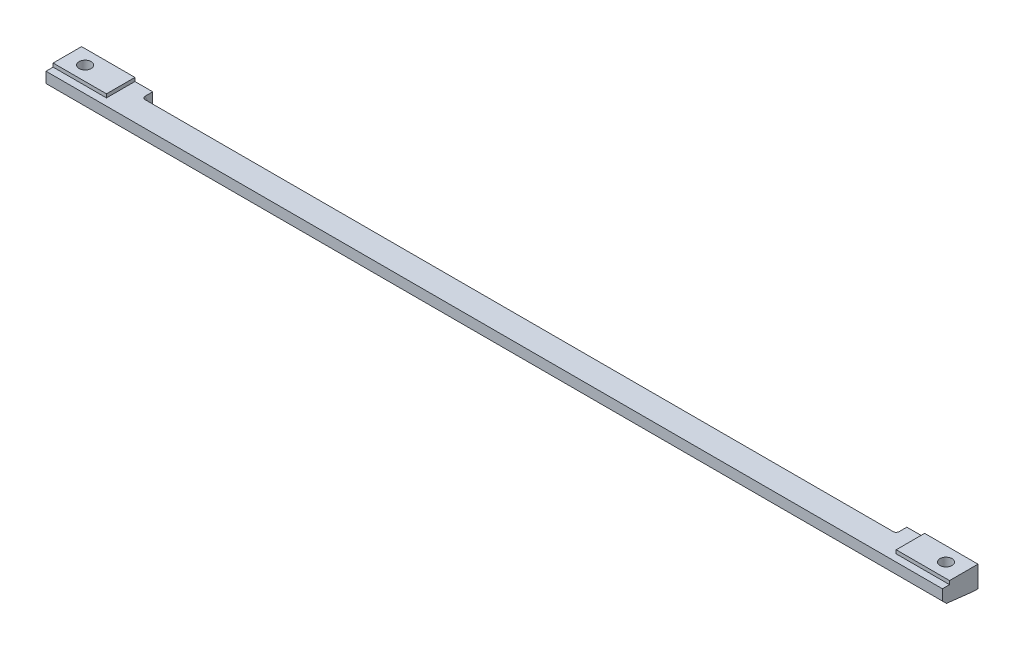
ISO-10303-21;
HEADER;
FILE_DESCRIPTION(('STEP AP214'),'2;1');
FILE_NAME('part.step','',(''),(''),'','','');
FILE_SCHEMA(('AUTOMOTIVE_DESIGN { 1 0 10303 214 1 1 1 1 }'));
ENDSEC;
DATA;
#1=APPLICATION_CONTEXT('core data for automotive mechanical design processes');
#2=APPLICATION_PROTOCOL_DEFINITION('international standard','automotive_design',2000,#1);
#3=PRODUCT_CONTEXT('',#1,'mechanical');
#4=PRODUCT('Part','Part','',(#3));
#5=PRODUCT_RELATED_PRODUCT_CATEGORY('part','',(#4));
#6=PRODUCT_DEFINITION_FORMATION('','',#4);
#7=PRODUCT_DEFINITION_CONTEXT('part definition',#1,'design');
#8=PRODUCT_DEFINITION('design','',#6,#7);
#9=PRODUCT_DEFINITION_SHAPE('','',#8);
#10=(LENGTH_UNIT() NAMED_UNIT(*) SI_UNIT(.MILLI.,.METRE.));
#11=(NAMED_UNIT(*) PLANE_ANGLE_UNIT() SI_UNIT($,.RADIAN.));
#12=(NAMED_UNIT(*) SI_UNIT($,.STERADIAN.) SOLID_ANGLE_UNIT());
#13=UNCERTAINTY_MEASURE_WITH_UNIT(LENGTH_MEASURE(1.E-05),#10,'distance_accuracy_value','');
#14=(GEOMETRIC_REPRESENTATION_CONTEXT(3) GLOBAL_UNCERTAINTY_ASSIGNED_CONTEXT((#13)) GLOBAL_UNIT_ASSIGNED_CONTEXT((#10,
#11,#12)) REPRESENTATION_CONTEXT('',''));
#15=CARTESIAN_POINT('',(0.,0.,0.));
#16=DIRECTION('',(0.,0.,1.));
#17=DIRECTION('',(1.,0.,0.));
#18=AXIS2_PLACEMENT_3D('',#15,#16,#17);
#19=CARTESIAN_POINT('',(-126.,0.,10.));
#20=DIRECTION('',(0.,1.,0.));
#21=DIRECTION('',(-1.,0.,0.));
#22=AXIS2_PLACEMENT_3D('',#19,#20,#21);
#23=PLANE('',#22);
#24=DIRECTION('',(-1.,0.,0.));
#25=VECTOR('',#24,1.);
#26=CARTESIAN_POINT('',(126.,0.,1.3));
#27=LINE('',#26,#25);
#28=CARTESIAN_POINT('',(126.,0.,1.3));
#29=VERTEX_POINT('',#28);
#30=CARTESIAN_POINT('',(122.809005251513,0.,1.3));
#31=VERTEX_POINT('',#30);
#32=EDGE_CURVE('E187',#29,#31,#27,.T.);
#33=ORIENTED_EDGE('',*,*,#32,.T.);
#34=CARTESIAN_POINT('',(121.,0.,4.));
#35=DIRECTION('',(0.,-1.,0.));
#36=DIRECTION('',(0.,0.,-1.));
#37=AXIS2_PLACEMENT_3D('',#34,#35,#36);
#38=CIRCLE('',#37,3.25);
#39=CARTESIAN_POINT('',(119.190994748487,0.,1.30000000000019));
#40=VERTEX_POINT('',#39);
#41=EDGE_CURVE('E54',#40,#31,#38,.T.);
#42=ORIENTED_EDGE('',*,*,#41,.F.);
#43=CARTESIAN_POINT('',(-119.190994748487,0.,1.3));
#44=VERTEX_POINT('',#43);
#45=EDGE_CURVE('E185',#40,#44,#27,.T.);
#46=ORIENTED_EDGE('',*,*,#45,.T.);
#47=CARTESIAN_POINT('',(-121.,0.,4.));
#48=DIRECTION('',(0.,-1.,0.));
#49=DIRECTION('',(0.,0.,-1.));
#50=AXIS2_PLACEMENT_3D('',#47,#48,#49);
#51=CIRCLE('',#50,3.25);
#52=CARTESIAN_POINT('',(-122.809005251513,0.,1.3));
#53=VERTEX_POINT('',#52);
#54=EDGE_CURVE('E296',#53,#44,#51,.T.);
#55=ORIENTED_EDGE('',*,*,#54,.F.);
#56=CARTESIAN_POINT('',(-126.,0.,1.3));
#57=VERTEX_POINT('',#56);
#58=EDGE_CURVE('E192',#53,#57,#27,.T.);
#59=ORIENTED_EDGE('',*,*,#58,.T.);
#60=DIRECTION('',(0.,0.,-1.));
#61=VECTOR('',#60,1.);
#62=CARTESIAN_POINT('',(-126.,0.,10.));
#63=LINE('',#62,#61);
#64=CARTESIAN_POINT('',(-126.,0.,0.));
#65=VERTEX_POINT('',#64);
#66=EDGE_CURVE('E249',#57,#65,#63,.T.);
#67=ORIENTED_EDGE('',*,*,#66,.T.);
#68=DIRECTION('',(1.,0.,0.));
#69=VECTOR('',#68,1.);
#70=CARTESIAN_POINT('',(-126.,0.,0.));
#71=LINE('',#70,#69);
#72=CARTESIAN_POINT('',(-105.997126220878,0.,0.));
#73=VERTEX_POINT('',#72);
#74=EDGE_CURVE('E220',#65,#73,#71,.T.);
#75=ORIENTED_EDGE('',*,*,#74,.T.);
#76=CARTESIAN_POINT('',(-105.2,0.,-0.0740160181598715));
#77=DIRECTION('',(0.,1.,0.));
#78=DIRECTION('',(0.,0.,1.));
#79=AXIS2_PLACEMENT_3D('',#76,#77,#78);
#80=ELLIPSE('',#79,0.874016018159853,0.8);
#81=CARTESIAN_POINT('',(-105.2,0.,0.8));
#82=VERTEX_POINT('',#81);
#83=EDGE_CURVE('E276',#73,#82,#80,.T.);
#84=ORIENTED_EDGE('',*,*,#83,.T.);
#85=DIRECTION('',(1.,0.,0.));
#86=VECTOR('',#85,1.);
#87=CARTESIAN_POINT('',(-106.,0.,0.8));
#88=LINE('',#87,#86);
#89=CARTESIAN_POINT('',(105.2,0.,0.8));
#90=VERTEX_POINT('',#89);
#91=EDGE_CURVE('E210',#82,#90,#88,.T.);
#92=ORIENTED_EDGE('',*,*,#91,.T.);
#93=CARTESIAN_POINT('',(105.2,0.,-0.0740160181598545));
#94=DIRECTION('',(0.,1.,0.));
#95=DIRECTION('',(0.,0.,-1.));
#96=AXIS2_PLACEMENT_3D('',#93,#94,#95);
#97=ELLIPSE('',#96,0.874016018159853,0.8);
#98=CARTESIAN_POINT('',(105.997126220878,0.,0.));
#99=VERTEX_POINT('',#98);
#100=EDGE_CURVE('E280',#90,#99,#97,.T.);
#101=ORIENTED_EDGE('',*,*,#100,.T.);
#102=CARTESIAN_POINT('',(126.,0.,0.));
#103=VERTEX_POINT('',#102);
#104=EDGE_CURVE('E246',#99,#103,#71,.T.);
#105=ORIENTED_EDGE('',*,*,#104,.T.);
#106=DIRECTION('',(0.,0.,-1.));
#107=VECTOR('',#106,1.);
#108=CARTESIAN_POINT('',(126.,0.,10.));
#109=LINE('',#108,#107);
#110=EDGE_CURVE('E224',#29,#103,#109,.T.);
#111=ORIENTED_EDGE('',*,*,#110,.F.);
#112=EDGE_LOOP('',(#33,#42,#46,#55,#59,#67,#75,#84,#92,#101,#105,#111));
#113=FACE_BOUND('',#112,.T.);
#114=ADVANCED_FACE('F40',(#113),#23,.F.);
#115=CARTESIAN_POINT('',(126.,6.00000000000005,0.));
#116=DIRECTION('',(0.,0.,1.));
#117=DIRECTION('',(1.,0.,0.));
#118=AXIS2_PLACEMENT_3D('',#115,#116,#117);
#119=PLANE('',#118);
#120=CARTESIAN_POINT('',(116.,3.50000000000005,0.));
#121=DIRECTION('',(0.,0.,-1.));
#122=DIRECTION('',(-1.,0.,0.));
#123=AXIS2_PLACEMENT_3D('',#120,#121,#122);
#124=CIRCLE('',#123,1.025);
#125=CARTESIAN_POINT('',(114.975,3.50000000000005,0.));
#126=VERTEX_POINT('',#125);
#127=EDGE_CURVE('E311',#126,#126,#124,.T.);
#128=ORIENTED_EDGE('',*,*,#127,.F.);
#129=EDGE_LOOP('',(#128));
#130=FACE_BOUND('',#129,.T.);
#131=ORIENTED_EDGE('',*,*,#104,.F.);
#132=CARTESIAN_POINT('',(105.2,0.168218223090618,0.));
#133=DIRECTION('',(0.,0.,1.));
#134=DIRECTION('',(0.,-1.,0.));
#135=AXIS2_PLACEMENT_3D('',#132,#133,#134);
#136=ELLIPSE('',#135,1.98640004127236,0.8);
#137=CARTESIAN_POINT('',(106.,0.168218223090618,0.));
#138=VERTEX_POINT('',#137);
#139=EDGE_CURVE('E283',#99,#138,#136,.T.);
#140=ORIENTED_EDGE('',*,*,#139,.T.);
#141=DIRECTION('',(0.,1.,0.));
#142=VECTOR('',#141,1.);
#143=CARTESIAN_POINT('',(106.,4.99999999999996,0.));
#144=LINE('',#143,#142);
#145=CARTESIAN_POINT('',(106.,4.99999999999996,0.));
#146=VERTEX_POINT('',#145);
#147=EDGE_CURVE('E194',#138,#146,#144,.T.);
#148=ORIENTED_EDGE('',*,*,#147,.T.);
#149=DIRECTION('',(-1.,0.,0.));
#150=VECTOR('',#149,1.);
#151=CARTESIAN_POINT('',(111.,4.99999999999996,0.));
#152=LINE('',#151,#150);
#153=CARTESIAN_POINT('',(111.,4.99999999999996,0.));
#154=VERTEX_POINT('',#153);
#155=EDGE_CURVE('E234',#154,#146,#152,.T.);
#156=ORIENTED_EDGE('',*,*,#155,.F.);
#157=DIRECTION('',(0.,-1.,0.));
#158=VECTOR('',#157,1.);
#159=CARTESIAN_POINT('',(111.,6.00000000000004,0.));
#160=LINE('',#159,#158);
#161=CARTESIAN_POINT('',(111.,6.00000000000004,0.));
#162=VERTEX_POINT('',#161);
#163=EDGE_CURVE('E230',#162,#154,#160,.T.);
#164=ORIENTED_EDGE('',*,*,#163,.F.);
#165=DIRECTION('',(-1.,0.,0.));
#166=VECTOR('',#165,1.);
#167=CARTESIAN_POINT('',(126.,6.00000000000005,0.));
#168=LINE('',#167,#166);
#169=CARTESIAN_POINT('',(126.,6.00000000000005,0.));
#170=VERTEX_POINT('',#169);
#171=EDGE_CURVE('E227',#170,#162,#168,.T.);
#172=ORIENTED_EDGE('',*,*,#171,.F.);
#173=DIRECTION('',(0.,1.,0.));
#174=VECTOR('',#173,1.);
#175=CARTESIAN_POINT('',(126.,0.,0.));
#176=LINE('',#175,#174);
#177=EDGE_CURVE('E213',#103,#170,#176,.T.);
#178=ORIENTED_EDGE('',*,*,#177,.F.);
#179=EDGE_LOOP('',(#131,#140,#148,#156,#164,#172,#178));
#180=FACE_BOUND('',#179,.T.);
#181=ADVANCED_FACE('F392',(#130,#180),#119,.F.);
#182=CARTESIAN_POINT('',(126.,0.,10.));
#183=DIRECTION('',(-1.,0.,0.));
#184=DIRECTION('',(0.,0.,1.));
#185=AXIS2_PLACEMENT_3D('',#182,#183,#184);
#186=PLANE('',#185);
#187=DIRECTION('',(0.,0.,-1.));
#188=VECTOR('',#187,1.);
#189=CARTESIAN_POINT('',(126.,6.00000000000005,10.));
#190=LINE('',#189,#188);
#191=CARTESIAN_POINT('',(126.,6.00000000000002,8.));
#192=VERTEX_POINT('',#191);
#193=EDGE_CURVE('E261',#192,#170,#190,.T.);
#194=ORIENTED_EDGE('',*,*,#193,.F.);
#195=DIRECTION('',(0.,1.,0.));
#196=VECTOR('',#195,1.);
#197=CARTESIAN_POINT('',(126.,5.00000000000002,8.));
#198=LINE('',#197,#196);
#199=CARTESIAN_POINT('',(126.,5.00000000000002,8.));
#200=VERTEX_POINT('',#199);
#201=EDGE_CURVE('E335',#200,#192,#198,.T.);
#202=ORIENTED_EDGE('',*,*,#201,.F.);
#203=DIRECTION('',(0.,0.,-1.));
#204=VECTOR('',#203,1.);
#205=CARTESIAN_POINT('',(126.,5.00000000000002,10.));
#206=LINE('',#205,#204);
#207=CARTESIAN_POINT('',(126.,5.00000000000002,10.));
#208=VERTEX_POINT('',#207);
#209=EDGE_CURVE('E330',#208,#200,#206,.T.);
#210=ORIENTED_EDGE('',*,*,#209,.F.);
#211=DIRECTION('',(0.,1.,0.));
#212=VECTOR('',#211,1.);
#213=CARTESIAN_POINT('',(126.,0.,10.));
#214=LINE('',#213,#212);
#215=CARTESIAN_POINT('',(126.,2.00000000000002,10.));
#216=VERTEX_POINT('',#215);
#217=EDGE_CURVE('E216',#216,#208,#214,.T.);
#218=ORIENTED_EDGE('',*,*,#217,.F.);
#219=DIRECTION('',(0.,-0.707106781186556,-0.707106781186539));
#220=VECTOR('',#219,1.);
#221=CARTESIAN_POINT('',(126.,0.870129870129871,8.87012987012988));
#222=LINE('',#221,#220);
#223=CARTESIAN_POINT('',(126.,0.870129870129871,8.87012987012988));
#224=VERTEX_POINT('',#223);
#225=EDGE_CURVE('E295',#216,#224,#222,.T.);
#226=ORIENTED_EDGE('',*,*,#225,.T.);
#227=DIRECTION('',(0.,-0.114190672624496,-0.993458851833112));
#228=VECTOR('',#227,1.);
#229=CARTESIAN_POINT('',(126.,0.,1.3));
#230=LINE('',#229,#228);
#231=EDGE_CURVE('E195',#224,#29,#230,.T.);
#232=ORIENTED_EDGE('',*,*,#231,.T.);
#233=ORIENTED_EDGE('',*,*,#110,.T.);
#234=ORIENTED_EDGE('',*,*,#177,.T.);
#235=EDGE_LOOP('',(#194,#202,#210,#218,#226,#232,#233,#234));
#236=FACE_BOUND('',#235,.T.);
#237=ADVANCED_FACE('F407',(#236),#186,.F.);
#238=CARTESIAN_POINT('',(126.,6.00000000000005,10.));
#239=DIRECTION('',(0.,-1.,0.));
#240=DIRECTION('',(1.,0.,0.));
#241=AXIS2_PLACEMENT_3D('',#238,#239,#240);
#242=PLANE('',#241);
#243=CARTESIAN_POINT('',(121.,6.00000000000009,4.));
#244=DIRECTION('',(0.,-1.,0.));
#245=DIRECTION('',(0.,0.,-1.));
#246=AXIS2_PLACEMENT_3D('',#243,#244,#245);
#247=CIRCLE('',#246,1.69999999999999);
#248=CARTESIAN_POINT('',(121.,6.00000000000009,2.30000000000001));
#249=VERTEX_POINT('',#248);
#250=EDGE_CURVE('E300',#249,#249,#247,.T.);
#251=ORIENTED_EDGE('',*,*,#250,.T.);
#252=EDGE_LOOP('',(#251));
#253=FACE_BOUND('',#252,.T.);
#254=DIRECTION('',(0.,0.,-1.));
#255=VECTOR('',#254,1.);
#256=CARTESIAN_POINT('',(111.,6.00000000000004,10.));
#257=LINE('',#256,#255);
#258=CARTESIAN_POINT('',(111.,6.00000000000002,8.));
#259=VERTEX_POINT('',#258);
#260=EDGE_CURVE('E259',#259,#162,#257,.T.);
#261=ORIENTED_EDGE('',*,*,#260,.F.);
#262=DIRECTION('',(-1.,0.,0.));
#263=VECTOR('',#262,1.);
#264=CARTESIAN_POINT('',(111.,6.00000000000002,8.));
#265=LINE('',#264,#263);
#266=EDGE_CURVE('E329',#192,#259,#265,.T.);
#267=ORIENTED_EDGE('',*,*,#266,.F.);
#268=ORIENTED_EDGE('',*,*,#193,.T.);
#269=ORIENTED_EDGE('',*,*,#171,.T.);
#270=EDGE_LOOP('',(#261,#267,#268,#269));
#271=FACE_BOUND('',#270,.T.);
#272=ADVANCED_FACE('F404',(#253,#271),#242,.F.);
#273=CARTESIAN_POINT('',(111.,6.00000000000004,10.));
#274=DIRECTION('',(1.,0.,0.));
#275=DIRECTION('',(0.,0.,-1.));
#276=AXIS2_PLACEMENT_3D('',#273,#274,#275);
#277=PLANE('',#276);
#278=DIRECTION('',(0.,0.,-1.));
#279=VECTOR('',#278,1.);
#280=CARTESIAN_POINT('',(111.,4.99999999999996,10.));
#281=LINE('',#280,#279);
#282=CARTESIAN_POINT('',(111.,5.00000000000002,8.));
#283=VERTEX_POINT('',#282);
#284=EDGE_CURVE('E257',#283,#154,#281,.T.);
#285=ORIENTED_EDGE('',*,*,#284,.F.);
#286=DIRECTION('',(0.,1.,0.));
#287=VECTOR('',#286,1.);
#288=CARTESIAN_POINT('',(111.,5.00000000000002,8.));
#289=LINE('',#288,#287);
#290=EDGE_CURVE('E337',#283,#259,#289,.T.);
#291=ORIENTED_EDGE('',*,*,#290,.T.);
#292=ORIENTED_EDGE('',*,*,#260,.T.);
#293=ORIENTED_EDGE('',*,*,#163,.T.);
#294=EDGE_LOOP('',(#285,#291,#292,#293));
#295=FACE_BOUND('',#294,.T.);
#296=ADVANCED_FACE('F400',(#295),#277,.F.);
#297=CARTESIAN_POINT('',(111.,4.99999999999996,10.));
#298=DIRECTION('',(0.,-1.,0.));
#299=DIRECTION('',(0.,0.,-1.));
#300=AXIS2_PLACEMENT_3D('',#297,#298,#299);
#301=PLANE('',#300);
#302=DIRECTION('',(1.,0.,0.));
#303=VECTOR('',#302,1.);
#304=CARTESIAN_POINT('',(-106.,4.99999999999996,3.));
#305=LINE('',#304,#303);
#306=CARTESIAN_POINT('',(-105.2,4.99999999999996,3.));
#307=VERTEX_POINT('',#306);
#308=CARTESIAN_POINT('',(105.2,4.99999999999996,3.));
#309=VERTEX_POINT('',#308);
#310=EDGE_CURVE('E206',#307,#309,#305,.T.);
#311=ORIENTED_EDGE('',*,*,#310,.F.);
#312=CARTESIAN_POINT('',(-105.2,4.99999999999996,2.12598398184015));
#313=DIRECTION('',(0.,-1.,0.));
#314=DIRECTION('',(0.,0.,1.));
#315=AXIS2_PLACEMENT_3D('',#312,#313,#314);
#316=ELLIPSE('',#315,0.874016018159853,0.8);
#317=CARTESIAN_POINT('',(-106.,4.99999999999996,2.12598398184015));
#318=VERTEX_POINT('',#317);
#319=EDGE_CURVE('E278',#307,#318,#316,.T.);
#320=ORIENTED_EDGE('',*,*,#319,.T.);
#321=DIRECTION('',(0.,0.,1.));
#322=VECTOR('',#321,1.);
#323=CARTESIAN_POINT('',(-106.,4.99999999999996,3.));
#324=LINE('',#323,#322);
#325=CARTESIAN_POINT('',(-106.,4.99999999999996,0.));
#326=VERTEX_POINT('',#325);
#327=EDGE_CURVE('E202',#326,#318,#324,.T.);
#328=ORIENTED_EDGE('',*,*,#327,.F.);
#329=CARTESIAN_POINT('',(-111.,4.99999999999996,0.));
#330=VERTEX_POINT('',#329);
#331=EDGE_CURVE('E233',#326,#330,#152,.T.);
#332=ORIENTED_EDGE('',*,*,#331,.T.);
#333=DIRECTION('',(0.,0.,-1.));
#334=VECTOR('',#333,1.);
#335=CARTESIAN_POINT('',(-111.,4.99999999999996,10.));
#336=LINE('',#335,#334);
#337=CARTESIAN_POINT('',(-111.,5.00000000000004,8.));
#338=VERTEX_POINT('',#337);
#339=EDGE_CURVE('E255',#338,#330,#336,.T.);
#340=ORIENTED_EDGE('',*,*,#339,.F.);
#341=DIRECTION('',(-1.,0.,0.));
#342=VECTOR('',#341,1.);
#343=CARTESIAN_POINT('',(-126.,5.00000000000005,8.));
#344=LINE('',#343,#342);
#345=CARTESIAN_POINT('',(-126.,5.00000000000005,8.));
#346=VERTEX_POINT('',#345);
#347=EDGE_CURVE('E345',#338,#346,#344,.T.);
#348=ORIENTED_EDGE('',*,*,#347,.T.);
#349=DIRECTION('',(0.,0.,1.));
#350=VECTOR('',#349,1.);
#351=CARTESIAN_POINT('',(-126.,5.00000000000005,10.));
#352=LINE('',#351,#350);
#353=CARTESIAN_POINT('',(-126.,5.00000000000005,10.));
#354=VERTEX_POINT('',#353);
#355=EDGE_CURVE('E342',#346,#354,#352,.T.);
#356=ORIENTED_EDGE('',*,*,#355,.T.);
#357=DIRECTION('',(-1.,0.,0.));
#358=VECTOR('',#357,1.);
#359=CARTESIAN_POINT('',(111.,4.99999999999996,10.));
#360=LINE('',#359,#358);
#361=EDGE_CURVE('E219',#208,#354,#360,.T.);
#362=ORIENTED_EDGE('',*,*,#361,.F.);
#363=ORIENTED_EDGE('',*,*,#209,.T.);
#364=DIRECTION('',(-1.,0.,0.));
#365=VECTOR('',#364,1.);
#366=CARTESIAN_POINT('',(111.,5.00000000000002,8.));
#367=LINE('',#366,#365);
#368=EDGE_CURVE('E332',#200,#283,#367,.T.);
#369=ORIENTED_EDGE('',*,*,#368,.T.);
#370=ORIENTED_EDGE('',*,*,#284,.T.);
#371=ORIENTED_EDGE('',*,*,#155,.T.);
#372=DIRECTION('',(0.,0.,1.));
#373=VECTOR('',#372,1.);
#374=CARTESIAN_POINT('',(106.,4.99999999999996,3.));
#375=LINE('',#374,#373);
#376=CARTESIAN_POINT('',(106.,4.99999999999996,2.12598398184015));
#377=VERTEX_POINT('',#376);
#378=EDGE_CURVE('E203',#146,#377,#375,.T.);
#379=ORIENTED_EDGE('',*,*,#378,.T.);
#380=CARTESIAN_POINT('',(105.2,4.99999999999996,2.12598398184015));
#381=DIRECTION('',(0.,-1.,0.));
#382=DIRECTION('',(0.,0.,-1.));
#383=AXIS2_PLACEMENT_3D('',#380,#381,#382);
#384=ELLIPSE('',#383,0.874016018159853,0.8);
#385=EDGE_CURVE('E285',#377,#309,#384,.T.);
#386=ORIENTED_EDGE('',*,*,#385,.T.);
#387=EDGE_LOOP('',(#311,#320,#328,#332,#340,#348,#356,#362,#363,#369,#370,#371,#379,#386));
#388=FACE_BOUND('',#387,.T.);
#389=ADVANCED_FACE('F380',(#388),#301,.F.);
#390=CARTESIAN_POINT('',(-111.,6.00000000000004,10.));
#391=DIRECTION('',(-1.,0.,0.));
#392=DIRECTION('',(0.,0.,1.));
#393=AXIS2_PLACEMENT_3D('',#390,#391,#392);
#394=PLANE('',#393);
#395=DIRECTION('',(0.,0.,-1.));
#396=VECTOR('',#395,1.);
#397=CARTESIAN_POINT('',(-111.,6.00000000000004,10.));
#398=LINE('',#397,#396);
#399=CARTESIAN_POINT('',(-111.,6.00000000000004,8.));
#400=VERTEX_POINT('',#399);
#401=CARTESIAN_POINT('',(-111.,6.00000000000004,0.));
#402=VERTEX_POINT('',#401);
#403=EDGE_CURVE('E253',#400,#402,#398,.T.);
#404=ORIENTED_EDGE('',*,*,#403,.F.);
#405=DIRECTION('',(0.,1.,0.));
#406=VECTOR('',#405,1.);
#407=CARTESIAN_POINT('',(-111.,5.00000000000004,8.));
#408=LINE('',#407,#406);
#409=EDGE_CURVE('E348',#338,#400,#408,.T.);
#410=ORIENTED_EDGE('',*,*,#409,.F.);
#411=ORIENTED_EDGE('',*,*,#339,.T.);
#412=DIRECTION('',(0.,1.,0.));
#413=VECTOR('',#412,1.);
#414=CARTESIAN_POINT('',(-111.,6.00000000000004,0.));
#415=LINE('',#414,#413);
#416=EDGE_CURVE('E237',#330,#402,#415,.T.);
#417=ORIENTED_EDGE('',*,*,#416,.T.);
#418=EDGE_LOOP('',(#404,#410,#411,#417));
#419=FACE_BOUND('',#418,.T.);
#420=ADVANCED_FACE('F429',(#419),#394,.F.);
#421=CARTESIAN_POINT('',(-126.,6.00000000000005,10.));
#422=DIRECTION('',(0.,-1.,0.));
#423=DIRECTION('',(1.,0.,0.));
#424=AXIS2_PLACEMENT_3D('',#421,#422,#423);
#425=PLANE('',#424);
#426=CARTESIAN_POINT('',(-121.,6.00000000000005,4.));
#427=DIRECTION('',(0.,-1.,0.));
#428=DIRECTION('',(0.,0.,-1.));
#429=AXIS2_PLACEMENT_3D('',#426,#427,#428);
#430=CIRCLE('',#429,1.69999999999999);
#431=CARTESIAN_POINT('',(-121.,6.00000000000005,2.30000000000001));
#432=VERTEX_POINT('',#431);
#433=EDGE_CURVE('E308',#432,#432,#430,.T.);
#434=ORIENTED_EDGE('',*,*,#433,.T.);
#435=EDGE_LOOP('',(#434));
#436=FACE_BOUND('',#435,.T.);
#437=DIRECTION('',(0.,0.,-1.));
#438=VECTOR('',#437,1.);
#439=CARTESIAN_POINT('',(-126.,6.00000000000005,10.));
#440=LINE('',#439,#438);
#441=CARTESIAN_POINT('',(-126.,6.00000000000005,8.));
#442=VERTEX_POINT('',#441);
#443=CARTESIAN_POINT('',(-126.,6.00000000000005,0.));
#444=VERTEX_POINT('',#443);
#445=EDGE_CURVE('E251',#442,#444,#440,.T.);
#446=ORIENTED_EDGE('',*,*,#445,.F.);
#447=DIRECTION('',(-1.,0.,0.));
#448=VECTOR('',#447,1.);
#449=CARTESIAN_POINT('',(-126.,6.00000000000005,8.));
#450=LINE('',#449,#448);
#451=EDGE_CURVE('E340',#400,#442,#450,.T.);
#452=ORIENTED_EDGE('',*,*,#451,.F.);
#453=ORIENTED_EDGE('',*,*,#403,.T.);
#454=DIRECTION('',(-1.,0.,0.));
#455=VECTOR('',#454,1.);
#456=CARTESIAN_POINT('',(-126.,6.00000000000005,0.));
#457=LINE('',#456,#455);
#458=EDGE_CURVE('E240',#402,#444,#457,.T.);
#459=ORIENTED_EDGE('',*,*,#458,.T.);
#460=EDGE_LOOP('',(#446,#452,#453,#459));
#461=FACE_BOUND('',#460,.T.);
#462=ADVANCED_FACE('F423',(#436,#461),#425,.F.);
#463=CARTESIAN_POINT('',(-126.,0.,10.));
#464=DIRECTION('',(1.,0.,0.));
#465=DIRECTION('',(0.,0.,-1.));
#466=AXIS2_PLACEMENT_3D('',#463,#464,#465);
#467=PLANE('',#466);
#468=ORIENTED_EDGE('',*,*,#355,.F.);
#469=DIRECTION('',(0.,1.,0.));
#470=VECTOR('',#469,1.);
#471=CARTESIAN_POINT('',(-126.,5.00000000000005,8.));
#472=LINE('',#471,#470);
#473=EDGE_CURVE('E350',#346,#442,#472,.T.);
#474=ORIENTED_EDGE('',*,*,#473,.T.);
#475=ORIENTED_EDGE('',*,*,#445,.T.);
#476=DIRECTION('',(0.,-1.,0.));
#477=VECTOR('',#476,1.);
#478=CARTESIAN_POINT('',(-126.,0.,0.));
#479=LINE('',#478,#477);
#480=EDGE_CURVE('E243',#444,#65,#479,.T.);
#481=ORIENTED_EDGE('',*,*,#480,.T.);
#482=ORIENTED_EDGE('',*,*,#66,.F.);
#483=DIRECTION('',(0.,-0.114190672624496,-0.993458851833112));
#484=VECTOR('',#483,1.);
#485=CARTESIAN_POINT('',(-126.,0.,1.3));
#486=LINE('',#485,#484);
#487=CARTESIAN_POINT('',(-126.,0.870129870129871,8.87012987012988));
#488=VERTEX_POINT('',#487);
#489=EDGE_CURVE('E198',#488,#57,#486,.T.);
#490=ORIENTED_EDGE('',*,*,#489,.F.);
#491=DIRECTION('',(0.,0.707106781186556,0.707106781186539));
#492=VECTOR('',#491,1.);
#493=CARTESIAN_POINT('',(-126.,0.870129870129871,8.87012987012988));
#494=LINE('',#493,#492);
#495=CARTESIAN_POINT('',(-126.,2.00000000000002,10.));
#496=VERTEX_POINT('',#495);
#497=EDGE_CURVE('E290',#488,#496,#494,.T.);
#498=ORIENTED_EDGE('',*,*,#497,.T.);
#499=DIRECTION('',(0.,-1.,0.));
#500=VECTOR('',#499,1.);
#501=CARTESIAN_POINT('',(-126.,0.,10.));
#502=LINE('',#501,#500);
#503=EDGE_CURVE('E222',#354,#496,#502,.T.);
#504=ORIENTED_EDGE('',*,*,#503,.F.);
#505=EDGE_LOOP('',(#468,#474,#475,#481,#482,#490,#498,#504));
#506=FACE_BOUND('',#505,.T.);
#507=ADVANCED_FACE('F361',(#506),#467,.F.);
#508=CARTESIAN_POINT('',(126.,6.00000000000005,10.));
#509=DIRECTION('',(0.,0.,1.));
#510=DIRECTION('',(1.,0.,0.));
#511=AXIS2_PLACEMENT_3D('',#508,#509,#510);
#512=PLANE('',#511);
#513=ORIENTED_EDGE('',*,*,#217,.T.);
#514=ORIENTED_EDGE('',*,*,#361,.T.);
#515=ORIENTED_EDGE('',*,*,#503,.T.);
#516=DIRECTION('',(1.,0.,0.));
#517=VECTOR('',#516,1.);
#518=CARTESIAN_POINT('',(126.,2.00000000000002,10.));
#519=LINE('',#518,#517);
#520=EDGE_CURVE('E293',#496,#216,#519,.T.);
#521=ORIENTED_EDGE('',*,*,#520,.T.);
#522=EDGE_LOOP('',(#513,#514,#515,#521));
#523=FACE_BOUND('',#522,.T.);
#524=ADVANCED_FACE('F415',(#523),#512,.T.);
#525=CARTESIAN_POINT('',(-116.,3.50000000000004,0.));
#526=DIRECTION('',(0.,0.,-1.));
#527=DIRECTION('',(-1.,0.,0.));
#528=AXIS2_PLACEMENT_3D('',#525,#526,#527);
#529=CIRCLE('',#528,1.025);
#530=CARTESIAN_POINT('',(-117.025,3.50000000000004,0.));
#531=VERTEX_POINT('',#530);
#532=EDGE_CURVE('E320',#531,#531,#529,.T.);
#533=ORIENTED_EDGE('',*,*,#532,.F.);
#534=EDGE_LOOP('',(#533));
#535=FACE_BOUND('',#534,.T.);
#536=ORIENTED_EDGE('',*,*,#331,.F.);
#537=DIRECTION('',(0.,1.,0.));
#538=VECTOR('',#537,1.);
#539=CARTESIAN_POINT('',(-106.,4.99999999999996,0.));
#540=LINE('',#539,#538);
#541=CARTESIAN_POINT('',(-106.,0.168218223090618,0.));
#542=VERTEX_POINT('',#541);
#543=EDGE_CURVE('E200',#542,#326,#540,.T.);
#544=ORIENTED_EDGE('',*,*,#543,.F.);
#545=CARTESIAN_POINT('',(-105.2,0.168218223090618,0.));
#546=DIRECTION('',(0.,0.,1.));
#547=DIRECTION('',(0.,1.,0.));
#548=AXIS2_PLACEMENT_3D('',#545,#546,#547);
#549=ELLIPSE('',#548,1.98640004127236,0.8);
#550=EDGE_CURVE('E273',#542,#73,#549,.T.);
#551=ORIENTED_EDGE('',*,*,#550,.T.);
#552=ORIENTED_EDGE('',*,*,#74,.F.);
#553=ORIENTED_EDGE('',*,*,#480,.F.);
#554=ORIENTED_EDGE('',*,*,#458,.F.);
#555=ORIENTED_EDGE('',*,*,#416,.F.);
#556=EDGE_LOOP('',(#536,#544,#551,#552,#553,#554,#555));
#557=FACE_BOUND('',#556,.T.);
#558=ADVANCED_FACE('F369',(#535,#557),#119,.F.);
#559=CARTESIAN_POINT('',(-106.,0.,0.8));
#560=DIRECTION('',(0.,-0.402738614266023,0.915315032422763));
#561=DIRECTION('',(0.,-0.915315032422763,-0.402738614266023));
#562=AXIS2_PLACEMENT_3D('',#559,#560,#561);
#563=PLANE('',#562);
#564=ORIENTED_EDGE('',*,*,#91,.F.);
#565=DIRECTION('',(0.,-0.915315032422763,-0.402738614266023));
#566=VECTOR('',#565,1.);
#567=CARTESIAN_POINT('',(-105.2,4.99999999999996,3.));
#568=LINE('',#567,#566);
#569=EDGE_CURVE('E269',#82,#307,#568,.F.);
#570=ORIENTED_EDGE('',*,*,#569,.T.);
#571=ORIENTED_EDGE('',*,*,#310,.T.);
#572=DIRECTION('',(0.,-0.915315032422763,-0.402738614266023));
#573=VECTOR('',#572,1.);
#574=CARTESIAN_POINT('',(105.2,0.,0.8));
#575=LINE('',#574,#573);
#576=EDGE_CURVE('E266',#309,#90,#575,.T.);
#577=ORIENTED_EDGE('',*,*,#576,.T.);
#578=EDGE_LOOP('',(#564,#570,#571,#577));
#579=FACE_BOUND('',#578,.T.);
#580=ADVANCED_FACE('F377',(#579),#563,.F.);
#581=CARTESIAN_POINT('',(-106.,0.,0.));
#582=DIRECTION('',(-1.,0.,0.));
#583=DIRECTION('',(0.,0.,1.));
#584=AXIS2_PLACEMENT_3D('',#581,#582,#583);
#585=PLANE('',#584);
#586=ORIENTED_EDGE('',*,*,#327,.T.);
#587=DIRECTION('',(0.,-0.915315032422763,-0.402738614266023));
#588=VECTOR('',#587,1.);
#589=CARTESIAN_POINT('',(-106.,0.322190891412864,0.0677479740617896));
#590=LINE('',#589,#588);
#591=EDGE_CURVE('E263',#318,#542,#590,.T.);
#592=ORIENTED_EDGE('',*,*,#591,.T.);
#593=ORIENTED_EDGE('',*,*,#543,.T.);
#594=EDGE_LOOP('',(#586,#592,#593));
#595=FACE_BOUND('',#594,.T.);
#596=ADVANCED_FACE('F433',(#595),#585,.F.);
#597=CARTESIAN_POINT('',(106.,0.,0.));
#598=DIRECTION('',(-1.,0.,0.));
#599=DIRECTION('',(0.,0.,1.));
#600=AXIS2_PLACEMENT_3D('',#597,#598,#599);
#601=PLANE('',#600);
#602=ORIENTED_EDGE('',*,*,#147,.F.);
#603=DIRECTION('',(0.,-0.915315032422763,-0.402738614266023));
#604=VECTOR('',#603,1.);
#605=CARTESIAN_POINT('',(106.,0.027284725193022,-0.0620107390749438));
#606=LINE('',#605,#604);
#607=EDGE_CURVE('E271',#138,#377,#606,.F.);
#608=ORIENTED_EDGE('',*,*,#607,.T.);
#609=ORIENTED_EDGE('',*,*,#378,.F.);
#610=EDGE_LOOP('',(#602,#608,#609));
#611=FACE_BOUND('',#610,.T.);
#612=ADVANCED_FACE('F395',(#611),#601,.T.);
#613=CARTESIAN_POINT('',(-105.2,0.0272847251930219,-0.0620107390749434));
#614=DIRECTION('',(0.,0.915315032422763,0.402738614266023));
#615=DIRECTION('',(0.,-0.402738614266023,0.915315032422763));
#616=AXIS2_PLACEMENT_3D('',#613,#614,#615);
#617=CYLINDRICAL_SURFACE('',#616,0.8);
#618=ORIENTED_EDGE('',*,*,#319,.F.);
#619=ORIENTED_EDGE('',*,*,#569,.F.);
#620=ORIENTED_EDGE('',*,*,#83,.F.);
#621=ORIENTED_EDGE('',*,*,#550,.F.);
#622=ORIENTED_EDGE('',*,*,#591,.F.);
#623=EDGE_LOOP('',(#618,#619,#620,#621,#622));
#624=FACE_BOUND('',#623,.T.);
#625=ADVANCED_FACE('F374',(#624),#617,.F.);
#626=CARTESIAN_POINT('',(105.2,0.322190891412864,0.0677479740617896));
#627=DIRECTION('',(0.,-0.915315032422763,-0.402738614266023));
#628=DIRECTION('',(0.,0.402738614266023,-0.915315032422763));
#629=AXIS2_PLACEMENT_3D('',#626,#627,#628);
#630=CYLINDRICAL_SURFACE('',#629,0.8);
#631=ORIENTED_EDGE('',*,*,#385,.F.);
#632=ORIENTED_EDGE('',*,*,#607,.F.);
#633=ORIENTED_EDGE('',*,*,#139,.F.);
#634=ORIENTED_EDGE('',*,*,#100,.F.);
#635=ORIENTED_EDGE('',*,*,#576,.F.);
#636=EDGE_LOOP('',(#631,#632,#633,#634,#635));
#637=FACE_BOUND('',#636,.T.);
#638=ADVANCED_FACE('F386',(#637),#630,.F.);
#639=CARTESIAN_POINT('',(126.,0.,1.3));
#640=DIRECTION('',(0.,0.993458851833112,-0.114190672624496));
#641=DIRECTION('',(0.,0.114190672624496,0.993458851833112));
#642=AXIS2_PLACEMENT_3D('',#639,#640,#641);
#643=PLANE('',#642);
#644=ORIENTED_EDGE('',*,*,#45,.F.);
#645=CARTESIAN_POINT('',(121.,0.310344827586207,4.));
#646=DIRECTION('',(0.,0.993458851833112,-0.114190672624496));
#647=DIRECTION('',(0.,-0.114190672624496,-0.993458851833112));
#648=AXIS2_PLACEMENT_3D('',#645,#646,#647);
#649=ELLIPSE('',#648,3.27139870363343,3.25);
#650=EDGE_CURVE('E11',#40,#31,#649,.T.);
#651=ORIENTED_EDGE('',*,*,#650,.T.);
#652=ORIENTED_EDGE('',*,*,#32,.F.);
#653=ORIENTED_EDGE('',*,*,#231,.F.);
#654=DIRECTION('',(-1.,0.,0.));
#655=VECTOR('',#654,1.);
#656=CARTESIAN_POINT('',(-126.,0.870129870129871,8.87012987012988));
#657=LINE('',#656,#655);
#658=EDGE_CURVE('E287',#224,#488,#657,.T.);
#659=ORIENTED_EDGE('',*,*,#658,.T.);
#660=ORIENTED_EDGE('',*,*,#489,.T.);
#661=ORIENTED_EDGE('',*,*,#58,.F.);
#662=CARTESIAN_POINT('',(-121.,0.310344827586207,4.));
#663=DIRECTION('',(0.,0.993458851833112,-0.114190672624496));
#664=DIRECTION('',(0.,-0.114190672624496,-0.993458851833112));
#665=AXIS2_PLACEMENT_3D('',#662,#663,#664);
#666=ELLIPSE('',#665,3.27139870363343,3.25);
#667=EDGE_CURVE('E48',#53,#44,#666,.T.);
#668=ORIENTED_EDGE('',*,*,#667,.T.);
#669=EDGE_LOOP('',(#644,#651,#652,#653,#659,#660,#661,#668));
#670=FACE_BOUND('',#669,.T.);
#671=ADVANCED_FACE('F190',(#670),#643,.F.);
#672=CARTESIAN_POINT('',(126.,0.870129870129871,8.87012987012988));
#673=DIRECTION('',(0.,-0.707106781186539,0.707106781186556));
#674=DIRECTION('',(0.,-0.707106781186556,-0.707106781186539));
#675=AXIS2_PLACEMENT_3D('',#672,#673,#674);
#676=PLANE('',#675);
#677=ORIENTED_EDGE('',*,*,#225,.F.);
#678=ORIENTED_EDGE('',*,*,#520,.F.);
#679=ORIENTED_EDGE('',*,*,#497,.F.);
#680=ORIENTED_EDGE('',*,*,#658,.F.);
#681=EDGE_LOOP('',(#677,#678,#679,#680));
#682=FACE_BOUND('',#681,.T.);
#683=ADVANCED_FACE('F42',(#682),#676,.T.);
#684=CARTESIAN_POINT('',(-126.,5.00000000000005,8.));
#685=DIRECTION('',(0.,0.,-1.));
#686=DIRECTION('',(-1.,0.,0.));
#687=AXIS2_PLACEMENT_3D('',#684,#685,#686);
#688=PLANE('',#687);
#689=ORIENTED_EDGE('',*,*,#451,.T.);
#690=ORIENTED_EDGE('',*,*,#473,.F.);
#691=ORIENTED_EDGE('',*,*,#347,.F.);
#692=ORIENTED_EDGE('',*,*,#409,.T.);
#693=EDGE_LOOP('',(#689,#690,#691,#692));
#694=FACE_BOUND('',#693,.T.);
#695=ADVANCED_FACE('F476',(#694),#688,.F.);
#696=CARTESIAN_POINT('',(111.,5.00000000000002,8.));
#697=DIRECTION('',(0.,0.,-1.));
#698=DIRECTION('',(-1.,0.,0.));
#699=AXIS2_PLACEMENT_3D('',#696,#697,#698);
#700=PLANE('',#699);
#701=ORIENTED_EDGE('',*,*,#266,.T.);
#702=ORIENTED_EDGE('',*,*,#290,.F.);
#703=ORIENTED_EDGE('',*,*,#368,.F.);
#704=ORIENTED_EDGE('',*,*,#201,.T.);
#705=EDGE_LOOP('',(#701,#702,#703,#704));
#706=FACE_BOUND('',#705,.T.);
#707=ADVANCED_FACE('F412',(#706),#700,.F.);
#708=CARTESIAN_POINT('',(-116.,3.50000000000004,6.));
#709=DIRECTION('',(0.,0.,-1.));
#710=DIRECTION('',(-1.,0.,0.));
#711=AXIS2_PLACEMENT_3D('',#708,#709,#710);
#712=CONICAL_SURFACE('',#711,0.799999999999995,1.02974425867665);
#713=CARTESIAN_POINT('',(-116.,3.50000000000004,6.48068849522205));
#714=VERTEX_POINT('',#713);
#715=VERTEX_LOOP('',#714);
#716=FACE_BOUND('',#715,.T.);
#717=CARTESIAN_POINT('',(-116.,3.50000000000004,6.));
#718=DIRECTION('',(0.,0.,-1.));
#719=DIRECTION('',(-1.,0.,0.));
#720=AXIS2_PLACEMENT_3D('',#717,#718,#719);
#721=CIRCLE('',#720,0.799999999999995);
#722=CARTESIAN_POINT('',(-116.8,3.50000000000004,6.));
#723=VERTEX_POINT('',#722);
#724=EDGE_CURVE('E326',#723,#723,#721,.T.);
#725=ORIENTED_EDGE('',*,*,#724,.T.);
#726=EDGE_LOOP('',(#725));
#727=FACE_BOUND('',#726,.T.);
#728=ADVANCED_FACE('F482',(#716,#727),#712,.F.);
#729=CARTESIAN_POINT('',(-116.,3.50000000000004,0.));
#730=DIRECTION('',(0.,0.,-1.));
#731=DIRECTION('',(-1.,0.,0.));
#732=AXIS2_PLACEMENT_3D('',#729,#730,#731);
#733=CYLINDRICAL_SURFACE('',#732,0.799999999999995);
#734=ORIENTED_EDGE('',*,*,#724,.F.);
#735=EDGE_LOOP('',(#734));
#736=FACE_BOUND('',#735,.T.);
#737=CARTESIAN_POINT('',(-116.,3.50000000000004,0.129903810567666));
#738=DIRECTION('',(0.,0.,-1.));
#739=DIRECTION('',(-1.,0.,0.));
#740=AXIS2_PLACEMENT_3D('',#737,#738,#739);
#741=CIRCLE('',#740,0.799999999999995);
#742=CARTESIAN_POINT('',(-116.8,3.50000000000004,0.129903810567666));
#743=VERTEX_POINT('',#742);
#744=EDGE_CURVE('E323',#743,#743,#741,.T.);
#745=ORIENTED_EDGE('',*,*,#744,.T.);
#746=EDGE_LOOP('',(#745));
#747=FACE_BOUND('',#746,.T.);
#748=ADVANCED_FACE('F485',(#736,#747),#733,.F.);
#749=CARTESIAN_POINT('',(-116.,3.50000000000004,0.));
#750=DIRECTION('',(0.,0.,-1.));
#751=DIRECTION('',(-1.,0.,0.));
#752=AXIS2_PLACEMENT_3D('',#749,#750,#751);
#753=CONICAL_SURFACE('',#752,1.025,1.0471975511966);
#754=ORIENTED_EDGE('',*,*,#744,.F.);
#755=EDGE_LOOP('',(#754));
#756=FACE_BOUND('',#755,.T.);
#757=ORIENTED_EDGE('',*,*,#532,.T.);
#758=EDGE_LOOP('',(#757));
#759=FACE_BOUND('',#758,.T.);
#760=ADVANCED_FACE('F489',(#756,#759),#753,.F.);
#761=CARTESIAN_POINT('',(116.,3.50000000000005,6.));
#762=DIRECTION('',(0.,0.,-1.));
#763=DIRECTION('',(-1.,0.,0.));
#764=AXIS2_PLACEMENT_3D('',#761,#762,#763);
#765=CONICAL_SURFACE('',#764,0.799999999999995,1.02974425867665);
#766=CARTESIAN_POINT('',(116.,3.50000000000005,6.48068849522205));
#767=VERTEX_POINT('',#766);
#768=VERTEX_LOOP('',#767);
#769=FACE_BOUND('',#768,.T.);
#770=CARTESIAN_POINT('',(116.,3.50000000000005,6.));
#771=DIRECTION('',(0.,0.,-1.));
#772=DIRECTION('',(-1.,0.,0.));
#773=AXIS2_PLACEMENT_3D('',#770,#771,#772);
#774=CIRCLE('',#773,0.799999999999995);
#775=CARTESIAN_POINT('',(115.2,3.50000000000005,6.));
#776=VERTEX_POINT('',#775);
#777=EDGE_CURVE('E317',#776,#776,#774,.T.);
#778=ORIENTED_EDGE('',*,*,#777,.T.);
#779=EDGE_LOOP('',(#778));
#780=FACE_BOUND('',#779,.T.);
#781=ADVANCED_FACE('F493',(#769,#780),#765,.F.);
#782=CARTESIAN_POINT('',(116.,3.50000000000005,0.));
#783=DIRECTION('',(0.,0.,-1.));
#784=DIRECTION('',(-1.,0.,0.));
#785=AXIS2_PLACEMENT_3D('',#782,#783,#784);
#786=CYLINDRICAL_SURFACE('',#785,0.799999999999995);
#787=ORIENTED_EDGE('',*,*,#777,.F.);
#788=EDGE_LOOP('',(#787));
#789=FACE_BOUND('',#788,.T.);
#790=CARTESIAN_POINT('',(116.,3.50000000000005,0.129903810567666));
#791=DIRECTION('',(0.,0.,-1.));
#792=DIRECTION('',(-1.,0.,0.));
#793=AXIS2_PLACEMENT_3D('',#790,#791,#792);
#794=CIRCLE('',#793,0.799999999999995);
#795=CARTESIAN_POINT('',(115.2,3.50000000000005,0.129903810567666));
#796=VERTEX_POINT('',#795);
#797=EDGE_CURVE('E314',#796,#796,#794,.T.);
#798=ORIENTED_EDGE('',*,*,#797,.T.);
#799=EDGE_LOOP('',(#798));
#800=FACE_BOUND('',#799,.T.);
#801=ADVANCED_FACE('F497',(#789,#800),#786,.F.);
#802=CARTESIAN_POINT('',(116.,3.50000000000005,0.));
#803=DIRECTION('',(0.,0.,-1.));
#804=DIRECTION('',(-1.,0.,0.));
#805=AXIS2_PLACEMENT_3D('',#802,#803,#804);
#806=CONICAL_SURFACE('',#805,1.025,1.0471975511966);
#807=ORIENTED_EDGE('',*,*,#797,.F.);
#808=EDGE_LOOP('',(#807));
#809=FACE_BOUND('',#808,.T.);
#810=ORIENTED_EDGE('',*,*,#127,.T.);
#811=EDGE_LOOP('',(#810));
#812=FACE_BOUND('',#811,.T.);
#813=ADVANCED_FACE('F501',(#809,#812),#806,.F.);
#814=CARTESIAN_POINT('',(-121.,0.,4.));
#815=DIRECTION('',(0.,-1.,0.));
#816=DIRECTION('',(0.,0.,-1.));
#817=AXIS2_PLACEMENT_3D('',#814,#815,#816);
#818=CYLINDRICAL_SURFACE('',#817,3.25);
#819=CARTESIAN_POINT('',(-121.,3.59999999999998,4.));
#820=DIRECTION('',(0.,-1.,0.));
#821=DIRECTION('',(0.,0.,-1.));
#822=AXIS2_PLACEMENT_3D('',#819,#820,#821);
#823=CIRCLE('',#822,3.25);
#824=CARTESIAN_POINT('',(-121.,3.59999999999998,0.749999999999997));
#825=VERTEX_POINT('',#824);
#826=EDGE_CURVE('E302',#825,#825,#823,.T.);
#827=ORIENTED_EDGE('',*,*,#826,.F.);
#828=EDGE_LOOP('',(#827));
#829=FACE_BOUND('',#828,.T.);
#830=ORIENTED_EDGE('',*,*,#54,.T.);
#831=ORIENTED_EDGE('',*,*,#667,.F.);
#832=EDGE_LOOP('',(#830,#831));
#833=FACE_BOUND('',#832,.T.);
#834=ADVANCED_FACE('F505',(#829,#833),#818,.F.);
#835=CARTESIAN_POINT('',(-121.,0.,4.));
#836=DIRECTION('',(0.,-1.,0.));
#837=DIRECTION('',(0.,0.,-1.));
#838=AXIS2_PLACEMENT_3D('',#835,#836,#837);
#839=CYLINDRICAL_SURFACE('',#838,1.69999999999999);
#840=ORIENTED_EDGE('',*,*,#433,.F.);
#841=EDGE_LOOP('',(#840));
#842=FACE_BOUND('',#841,.T.);
#843=CARTESIAN_POINT('',(-121.,3.59999999999998,4.));
#844=DIRECTION('',(0.,-1.,0.));
#845=DIRECTION('',(0.,0.,-1.));
#846=AXIS2_PLACEMENT_3D('',#843,#844,#845);
#847=CIRCLE('',#846,1.69999999999999);
#848=CARTESIAN_POINT('',(-121.,3.59999999999998,2.30000000000001));
#849=VERTEX_POINT('',#848);
#850=EDGE_CURVE('E305',#849,#849,#847,.T.);
#851=ORIENTED_EDGE('',*,*,#850,.T.);
#852=EDGE_LOOP('',(#851));
#853=FACE_BOUND('',#852,.T.);
#854=ADVANCED_FACE('F507',(#842,#853),#839,.F.);
#855=CARTESIAN_POINT('',(-119.3,3.59999999999998,4.));
#856=DIRECTION('',(0.,1.,0.));
#857=DIRECTION('',(0.,0.,1.));
#858=AXIS2_PLACEMENT_3D('',#855,#856,#857);
#859=PLANE('',#858);
#860=ORIENTED_EDGE('',*,*,#850,.F.);
#861=EDGE_LOOP('',(#860));
#862=FACE_BOUND('',#861,.T.);
#863=ORIENTED_EDGE('',*,*,#826,.T.);
#864=EDGE_LOOP('',(#863));
#865=FACE_BOUND('',#864,.T.);
#866=ADVANCED_FACE('F510',(#862,#865),#859,.F.);
#867=CARTESIAN_POINT('',(121.,0.,4.));
#868=DIRECTION('',(0.,-1.,0.));
#869=DIRECTION('',(0.,0.,-1.));
#870=AXIS2_PLACEMENT_3D('',#867,#868,#869);
#871=CYLINDRICAL_SURFACE('',#870,3.25);
#872=CARTESIAN_POINT('',(121.,3.60000000000002,4.));
#873=DIRECTION('',(0.,-1.,0.));
#874=DIRECTION('',(0.,0.,-1.));
#875=AXIS2_PLACEMENT_3D('',#872,#873,#874);
#876=CIRCLE('',#875,3.25);
#877=CARTESIAN_POINT('',(121.,3.60000000000002,0.749999999999997));
#878=VERTEX_POINT('',#877);
#879=EDGE_CURVE('E188',#878,#878,#876,.T.);
#880=ORIENTED_EDGE('',*,*,#879,.F.);
#881=EDGE_LOOP('',(#880));
#882=FACE_BOUND('',#881,.T.);
#883=ORIENTED_EDGE('',*,*,#41,.T.);
#884=ORIENTED_EDGE('',*,*,#650,.F.);
#885=EDGE_LOOP('',(#883,#884));
#886=FACE_BOUND('',#885,.T.);
#887=ADVANCED_FACE('F179',(#882,#886),#871,.F.);
#888=CARTESIAN_POINT('',(121.,0.,4.));
#889=DIRECTION('',(0.,-1.,0.));
#890=DIRECTION('',(0.,0.,-1.));
#891=AXIS2_PLACEMENT_3D('',#888,#889,#890);
#892=CYLINDRICAL_SURFACE('',#891,1.69999999999999);
#893=ORIENTED_EDGE('',*,*,#250,.F.);
#894=EDGE_LOOP('',(#893));
#895=FACE_BOUND('',#894,.T.);
#896=CARTESIAN_POINT('',(121.,3.60000000000002,4.));
#897=DIRECTION('',(0.,-1.,0.));
#898=DIRECTION('',(0.,0.,-1.));
#899=AXIS2_PLACEMENT_3D('',#896,#897,#898);
#900=CIRCLE('',#899,1.69999999999999);
#901=CARTESIAN_POINT('',(121.,3.60000000000002,2.30000000000001));
#902=VERTEX_POINT('',#901);
#903=EDGE_CURVE('E533',#902,#902,#900,.T.);
#904=ORIENTED_EDGE('',*,*,#903,.T.);
#905=EDGE_LOOP('',(#904));
#906=FACE_BOUND('',#905,.T.);
#907=ADVANCED_FACE('F518',(#895,#906),#892,.F.);
#908=CARTESIAN_POINT('',(122.7,3.60000000000002,4.));
#909=DIRECTION('',(0.,1.,0.));
#910=DIRECTION('',(0.,0.,1.));
#911=AXIS2_PLACEMENT_3D('',#908,#909,#910);
#912=PLANE('',#911);
#913=ORIENTED_EDGE('',*,*,#903,.F.);
#914=EDGE_LOOP('',(#913));
#915=FACE_BOUND('',#914,.T.);
#916=ORIENTED_EDGE('',*,*,#879,.T.);
#917=EDGE_LOOP('',(#916));
#918=FACE_BOUND('',#917,.T.);
#919=ADVANCED_FACE('F521',(#915,#918),#912,.F.);
#920=CLOSED_SHELL('',(#114,#181,#237,#272,#296,#389,#420,#462,#507,#524,#558,#580,#596,#612,
#625,#638,#671,#683,#695,#707,#728,#748,#760,#781,#801,#813,#834,#854,#866,#887,#907,#919));
#921=MANIFOLD_SOLID_BREP('B2',#920);
#922=ADVANCED_BREP_SHAPE_REPRESENTATION('',(#18,#921),#14);
#923=SHAPE_DEFINITION_REPRESENTATION(#9,#922);
ENDSEC;
END-ISO-10303-21;
